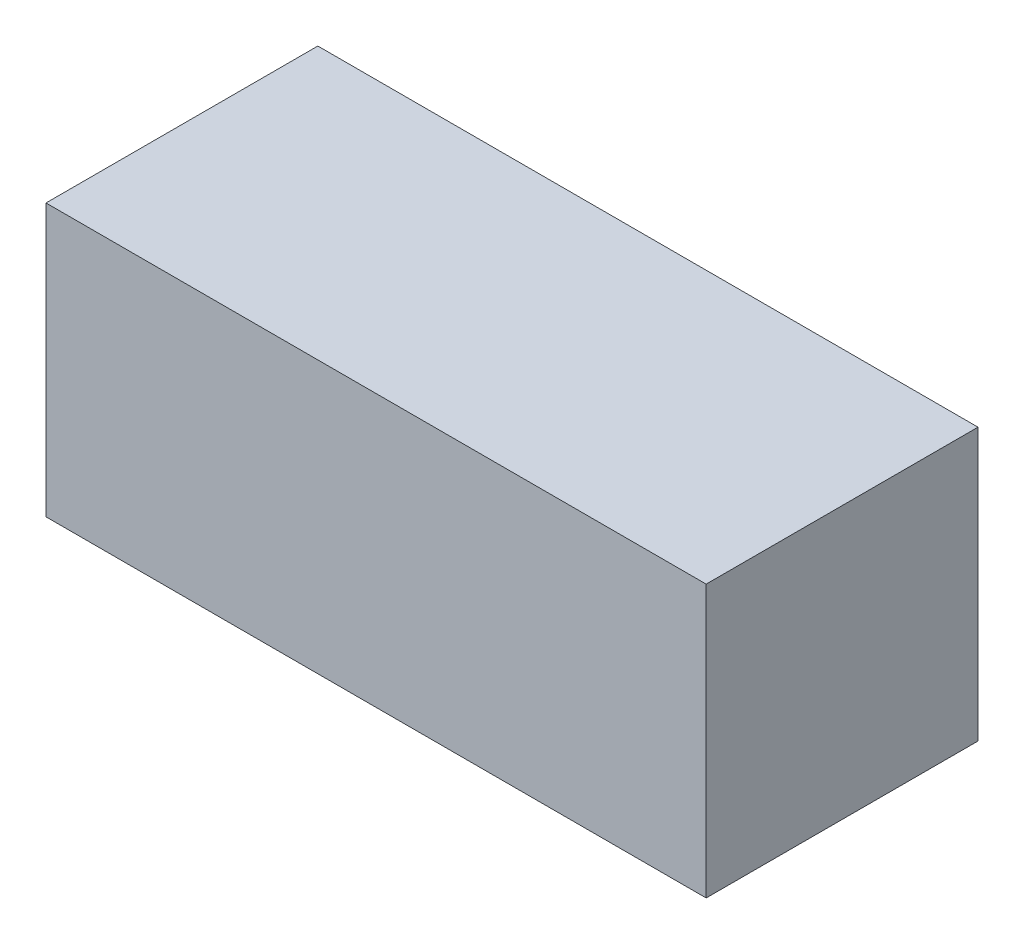
ISO-10303-21;
HEADER;
FILE_DESCRIPTION(('STEP AP214'),'2;1');
FILE_NAME('part.step','',(''),(''),'','','');
FILE_SCHEMA(('AUTOMOTIVE_DESIGN { 1 0 10303 214 1 1 1 1 }'));
ENDSEC;
DATA;
#1=APPLICATION_CONTEXT('core data for automotive mechanical design processes');
#2=APPLICATION_PROTOCOL_DEFINITION('international standard','automotive_design',2000,#1);
#3=PRODUCT_CONTEXT('',#1,'mechanical');
#4=PRODUCT('Part','Part','',(#3));
#5=PRODUCT_RELATED_PRODUCT_CATEGORY('part','',(#4));
#6=PRODUCT_DEFINITION_FORMATION('','',#4);
#7=PRODUCT_DEFINITION_CONTEXT('part definition',#1,'design');
#8=PRODUCT_DEFINITION('design','',#6,#7);
#9=PRODUCT_DEFINITION_SHAPE('','',#8);
#10=(LENGTH_UNIT() NAMED_UNIT(*) SI_UNIT(.MILLI.,.METRE.));
#11=(NAMED_UNIT(*) PLANE_ANGLE_UNIT() SI_UNIT($,.RADIAN.));
#12=(NAMED_UNIT(*) SI_UNIT($,.STERADIAN.) SOLID_ANGLE_UNIT());
#13=UNCERTAINTY_MEASURE_WITH_UNIT(LENGTH_MEASURE(1.E-05),#10,'distance_accuracy_value','');
#14=(GEOMETRIC_REPRESENTATION_CONTEXT(3) GLOBAL_UNCERTAINTY_ASSIGNED_CONTEXT((#13)) GLOBAL_UNIT_ASSIGNED_CONTEXT((#10,
#11,#12)) REPRESENTATION_CONTEXT('',''));
#15=CARTESIAN_POINT('',(0.,0.,0.));
#16=DIRECTION('',(0.,0.,1.));
#17=DIRECTION('',(1.,0.,0.));
#18=AXIS2_PLACEMENT_3D('',#15,#16,#17);
#19=CARTESIAN_POINT('',(85.,70.,35.));
#20=DIRECTION('',(-1.,0.,0.));
#21=DIRECTION('',(0.,0.,1.));
#22=AXIS2_PLACEMENT_3D('',#19,#20,#21);
#23=PLANE('',#22);
#24=DIRECTION('',(0.,0.,-1.));
#25=VECTOR('',#24,1.);
#26=CARTESIAN_POINT('',(85.,0.,35.));
#27=LINE('',#26,#25);
#28=CARTESIAN_POINT('',(85.,0.,35.));
#29=VERTEX_POINT('',#28);
#30=CARTESIAN_POINT('',(85.,0.,-35.));
#31=VERTEX_POINT('',#30);
#32=EDGE_CURVE('E115',#29,#31,#27,.T.);
#33=ORIENTED_EDGE('',*,*,#32,.T.);
#34=DIRECTION('',(0.,-1.,0.));
#35=VECTOR('',#34,1.);
#36=CARTESIAN_POINT('',(85.,70.,-35.));
#37=LINE('',#36,#35);
#38=CARTESIAN_POINT('',(85.,70.,-35.));
#39=VERTEX_POINT('',#38);
#40=EDGE_CURVE('E11',#39,#31,#37,.T.);
#41=ORIENTED_EDGE('',*,*,#40,.F.);
#42=DIRECTION('',(0.,0.,-1.));
#43=VECTOR('',#42,1.);
#44=CARTESIAN_POINT('',(85.,70.,35.));
#45=LINE('',#44,#43);
#46=CARTESIAN_POINT('',(85.,70.,35.));
#47=VERTEX_POINT('',#46);
#48=EDGE_CURVE('E97',#47,#39,#45,.T.);
#49=ORIENTED_EDGE('',*,*,#48,.F.);
#50=DIRECTION('',(0.,-1.,0.));
#51=VECTOR('',#50,1.);
#52=CARTESIAN_POINT('',(85.,70.,35.));
#53=LINE('',#52,#51);
#54=EDGE_CURVE('E111',#47,#29,#53,.T.);
#55=ORIENTED_EDGE('',*,*,#54,.T.);
#56=EDGE_LOOP('',(#33,#41,#49,#55));
#57=FACE_BOUND('',#56,.T.);
#58=ADVANCED_FACE('F45',(#57),#23,.F.);
#59=CARTESIAN_POINT('',(-85.,70.,-35.));
#60=DIRECTION('',(0.,0.,1.));
#61=DIRECTION('',(1.,0.,0.));
#62=AXIS2_PLACEMENT_3D('',#59,#60,#61);
#63=PLANE('',#62);
#64=DIRECTION('',(-1.,0.,0.));
#65=VECTOR('',#64,1.);
#66=CARTESIAN_POINT('',(-85.,0.,-35.));
#67=LINE('',#66,#65);
#68=CARTESIAN_POINT('',(-85.,0.,-35.));
#69=VERTEX_POINT('',#68);
#70=EDGE_CURVE('E102',#31,#69,#67,.T.);
#71=ORIENTED_EDGE('',*,*,#70,.T.);
#72=DIRECTION('',(0.,-1.,0.));
#73=VECTOR('',#72,1.);
#74=CARTESIAN_POINT('',(-85.,70.,-35.));
#75=LINE('',#74,#73);
#76=CARTESIAN_POINT('',(-85.,70.,-35.));
#77=VERTEX_POINT('',#76);
#78=EDGE_CURVE('E54',#77,#69,#75,.T.);
#79=ORIENTED_EDGE('',*,*,#78,.F.);
#80=DIRECTION('',(-1.,0.,0.));
#81=VECTOR('',#80,1.);
#82=CARTESIAN_POINT('',(-85.,70.,-35.));
#83=LINE('',#82,#81);
#84=EDGE_CURVE('E92',#39,#77,#83,.T.);
#85=ORIENTED_EDGE('',*,*,#84,.F.);
#86=ORIENTED_EDGE('',*,*,#40,.T.);
#87=EDGE_LOOP('',(#71,#79,#85,#86));
#88=FACE_BOUND('',#87,.T.);
#89=ADVANCED_FACE('F101',(#88),#63,.F.);
#90=CARTESIAN_POINT('',(-85.,70.,35.));
#91=DIRECTION('',(1.,0.,0.));
#92=DIRECTION('',(0.,0.,-1.));
#93=AXIS2_PLACEMENT_3D('',#90,#91,#92);
#94=PLANE('',#93);
#95=DIRECTION('',(0.,0.,1.));
#96=VECTOR('',#95,1.);
#97=CARTESIAN_POINT('',(-85.,0.,35.));
#98=LINE('',#97,#96);
#99=CARTESIAN_POINT('',(-85.,0.,35.));
#100=VERTEX_POINT('',#99);
#101=EDGE_CURVE('E79',#69,#100,#98,.T.);
#102=ORIENTED_EDGE('',*,*,#101,.T.);
#103=DIRECTION('',(0.,-1.,0.));
#104=VECTOR('',#103,1.);
#105=CARTESIAN_POINT('',(-85.,70.,35.));
#106=LINE('',#105,#104);
#107=CARTESIAN_POINT('',(-85.,70.,35.));
#108=VERTEX_POINT('',#107);
#109=EDGE_CURVE('E104',#108,#100,#106,.T.);
#110=ORIENTED_EDGE('',*,*,#109,.F.);
#111=DIRECTION('',(0.,0.,1.));
#112=VECTOR('',#111,1.);
#113=CARTESIAN_POINT('',(-85.,70.,35.));
#114=LINE('',#113,#112);
#115=EDGE_CURVE('E95',#77,#108,#114,.T.);
#116=ORIENTED_EDGE('',*,*,#115,.F.);
#117=ORIENTED_EDGE('',*,*,#78,.T.);
#118=EDGE_LOOP('',(#102,#110,#116,#117));
#119=FACE_BOUND('',#118,.T.);
#120=ADVANCED_FACE('F105',(#119),#94,.F.);
#121=CARTESIAN_POINT('',(-85.,70.,35.));
#122=DIRECTION('',(0.,0.,-1.));
#123=DIRECTION('',(-1.,0.,0.));
#124=AXIS2_PLACEMENT_3D('',#121,#122,#123);
#125=PLANE('',#124);
#126=DIRECTION('',(1.,0.,0.));
#127=VECTOR('',#126,1.);
#128=CARTESIAN_POINT('',(-85.,0.,35.));
#129=LINE('',#128,#127);
#130=EDGE_CURVE('E85',#100,#29,#129,.T.);
#131=ORIENTED_EDGE('',*,*,#130,.T.);
#132=ORIENTED_EDGE('',*,*,#54,.F.);
#133=DIRECTION('',(1.,0.,0.));
#134=VECTOR('',#133,1.);
#135=CARTESIAN_POINT('',(-85.,70.,35.));
#136=LINE('',#135,#134);
#137=EDGE_CURVE('E62',#108,#47,#136,.T.);
#138=ORIENTED_EDGE('',*,*,#137,.F.);
#139=ORIENTED_EDGE('',*,*,#109,.T.);
#140=EDGE_LOOP('',(#131,#132,#138,#139));
#141=FACE_BOUND('',#140,.T.);
#142=ADVANCED_FACE('F129',(#141),#125,.F.);
#143=CARTESIAN_POINT('',(0.,70.,0.));
#144=DIRECTION('',(0.,-1.,0.));
#145=DIRECTION('',(0.,0.,-1.));
#146=AXIS2_PLACEMENT_3D('',#143,#144,#145);
#147=PLANE('',#146);
#148=ORIENTED_EDGE('',*,*,#48,.T.);
#149=ORIENTED_EDGE('',*,*,#84,.T.);
#150=ORIENTED_EDGE('',*,*,#115,.T.);
#151=ORIENTED_EDGE('',*,*,#137,.T.);
#152=EDGE_LOOP('',(#148,#149,#150,#151));
#153=FACE_BOUND('',#152,.T.);
#154=ADVANCED_FACE('F93',(#153),#147,.F.);
#155=CARTESIAN_POINT('',(0.,0.,0.));
#156=DIRECTION('',(0.,-1.,0.));
#157=DIRECTION('',(0.,0.,-1.));
#158=AXIS2_PLACEMENT_3D('',#155,#156,#157);
#159=PLANE('',#158);
#160=ORIENTED_EDGE('',*,*,#32,.F.);
#161=ORIENTED_EDGE('',*,*,#130,.F.);
#162=ORIENTED_EDGE('',*,*,#101,.F.);
#163=ORIENTED_EDGE('',*,*,#70,.F.);
#164=EDGE_LOOP('',(#160,#161,#162,#163));
#165=FACE_BOUND('',#164,.T.);
#166=ADVANCED_FACE('F132',(#165),#159,.T.);
#167=CLOSED_SHELL('',(#58,#89,#120,#142,#154,#166));
#168=MANIFOLD_SOLID_BREP('B2',#167);
#169=ADVANCED_BREP_SHAPE_REPRESENTATION('',(#18,#168),#14);
#170=SHAPE_DEFINITION_REPRESENTATION(#9,#169);
ENDSEC;
END-ISO-10303-21;
